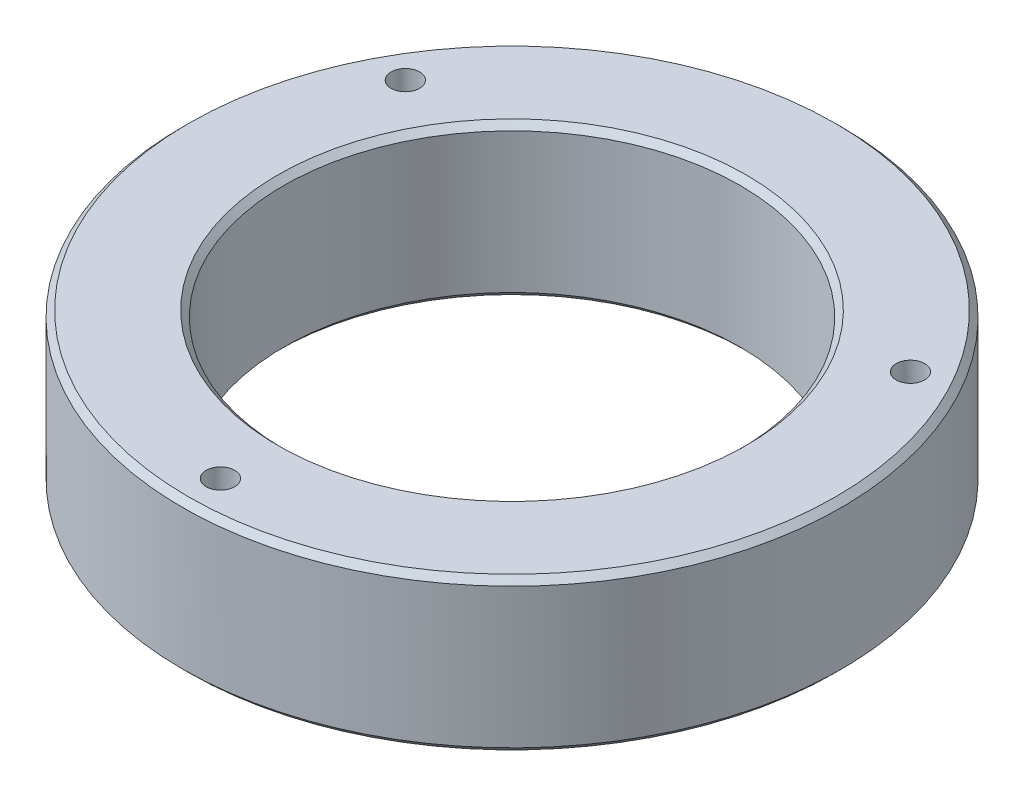
ISO-10303-21;
HEADER;
FILE_DESCRIPTION(('STEP AP214'),'2;1');
FILE_NAME('part.step','',(''),(''),'','','');
FILE_SCHEMA(('AUTOMOTIVE_DESIGN { 1 0 10303 214 1 1 1 1 }'));
ENDSEC;
DATA;
#1=APPLICATION_CONTEXT('core data for automotive mechanical design processes');
#2=APPLICATION_PROTOCOL_DEFINITION('international standard','automotive_design',2000,#1);
#3=PRODUCT_CONTEXT('',#1,'mechanical');
#4=PRODUCT('Part','Part','',(#3));
#5=PRODUCT_RELATED_PRODUCT_CATEGORY('part','',(#4));
#6=PRODUCT_DEFINITION_FORMATION('','',#4);
#7=PRODUCT_DEFINITION_CONTEXT('part definition',#1,'design');
#8=PRODUCT_DEFINITION('design','',#6,#7);
#9=PRODUCT_DEFINITION_SHAPE('','',#8);
#10=(LENGTH_UNIT() NAMED_UNIT(*) SI_UNIT(.MILLI.,.METRE.));
#11=(NAMED_UNIT(*) PLANE_ANGLE_UNIT() SI_UNIT($,.RADIAN.));
#12=(NAMED_UNIT(*) SI_UNIT($,.STERADIAN.) SOLID_ANGLE_UNIT());
#13=UNCERTAINTY_MEASURE_WITH_UNIT(LENGTH_MEASURE(1.E-05),#10,'distance_accuracy_value','');
#14=(GEOMETRIC_REPRESENTATION_CONTEXT(3) GLOBAL_UNCERTAINTY_ASSIGNED_CONTEXT((#13)) GLOBAL_UNIT_ASSIGNED_CONTEXT((#10,
#11,#12)) REPRESENTATION_CONTEXT('',''));
#15=CARTESIAN_POINT('',(0.,0.,0.));
#16=DIRECTION('',(0.,0.,1.));
#17=DIRECTION('',(1.,0.,0.));
#18=AXIS2_PLACEMENT_3D('',#15,#16,#17);
#19=CARTESIAN_POINT('',(-57.15,-19.05,0.));
#20=DIRECTION('',(0.,1.,0.));
#21=DIRECTION('',(0.,0.,1.));
#22=AXIS2_PLACEMENT_3D('',#19,#20,#21);
#23=PLANE('',#22);
#24=CARTESIAN_POINT('',(69.85,-19.05,0.));
#25=DIRECTION('',(0.,-1.,0.));
#26=DIRECTION('',(0.,0.,-1.));
#27=AXIS2_PLACEMENT_3D('',#24,#25,#26);
#28=CIRCLE('',#27,3.96874999999999);
#29=CARTESIAN_POINT('',(69.85,-19.05,-3.96874999999999));
#30=VERTEX_POINT('',#29);
#31=EDGE_CURVE('E75',#30,#30,#28,.T.);
#32=ORIENTED_EDGE('',*,*,#31,.F.);
#33=EDGE_LOOP('',(#32));
#34=FACE_BOUND('',#33,.T.);
#35=CARTESIAN_POINT('',(-69.85,-19.05,0.));
#36=DIRECTION('',(0.,-1.,0.));
#37=DIRECTION('',(0.,0.,-1.));
#38=AXIS2_PLACEMENT_3D('',#35,#36,#37);
#39=CIRCLE('',#38,3.96874999999999);
#40=CARTESIAN_POINT('',(-69.85,-19.05,-3.96874999999999));
#41=VERTEX_POINT('',#40);
#42=EDGE_CURVE('E74',#41,#41,#39,.T.);
#43=ORIENTED_EDGE('',*,*,#42,.F.);
#44=EDGE_LOOP('',(#43));
#45=FACE_BOUND('',#44,.T.);
#46=CARTESIAN_POINT('',(0.,-19.05,73.025));
#47=DIRECTION('',(0.,1.,0.));
#48=DIRECTION('',(0.,0.,1.));
#49=AXIS2_PLACEMENT_3D('',#46,#47,#48);
#50=CIRCLE('',#49,5.5626);
#51=CARTESIAN_POINT('',(0.,-19.05,78.5876));
#52=VERTEX_POINT('',#51);
#53=EDGE_CURVE('E90',#52,#52,#50,.T.);
#54=ORIENTED_EDGE('',*,*,#53,.T.);
#55=EDGE_LOOP('',(#54));
#56=FACE_BOUND('',#55,.T.);
#57=CARTESIAN_POINT('',(63.246,-19.05,-36.5252));
#58=DIRECTION('',(0.,1.,0.));
#59=DIRECTION('',(0.,0.,1.));
#60=AXIS2_PLACEMENT_3D('',#57,#58,#59);
#61=CIRCLE('',#60,5.5626);
#62=CARTESIAN_POINT('',(63.246,-19.05,-30.9626));
#63=VERTEX_POINT('',#62);
#64=EDGE_CURVE('E93',#63,#63,#61,.T.);
#65=ORIENTED_EDGE('',*,*,#64,.T.);
#66=EDGE_LOOP('',(#65));
#67=FACE_BOUND('',#66,.T.);
#68=CARTESIAN_POINT('',(-63.246,-19.05,-36.5252));
#69=DIRECTION('',(0.,1.,0.));
#70=DIRECTION('',(0.,0.,1.));
#71=AXIS2_PLACEMENT_3D('',#68,#69,#70);
#72=CIRCLE('',#71,5.5626);
#73=CARTESIAN_POINT('',(-63.246,-19.05,-30.9626));
#74=VERTEX_POINT('',#73);
#75=EDGE_CURVE('E99',#74,#74,#72,.T.);
#76=ORIENTED_EDGE('',*,*,#75,.T.);
#77=EDGE_LOOP('',(#76));
#78=FACE_BOUND('',#77,.T.);
#79=CARTESIAN_POINT('',(0.,-19.05,0.));
#80=DIRECTION('',(0.,1.,0.));
#81=DIRECTION('',(0.,0.,1.));
#82=AXIS2_PLACEMENT_3D('',#79,#80,#81);
#83=CIRCLE('',#82,58.674);
#84=CARTESIAN_POINT('',(0.,-19.05,-58.674));
#85=VERTEX_POINT('',#84);
#86=EDGE_CURVE('E120',#85,#85,#83,.T.);
#87=ORIENTED_EDGE('',*,*,#86,.T.);
#88=EDGE_LOOP('',(#87));
#89=FACE_BOUND('',#88,.T.);
#90=CARTESIAN_POINT('',(0.,-19.05,0.));
#91=DIRECTION('',(0.,1.,0.));
#92=DIRECTION('',(0.,0.,1.));
#93=AXIS2_PLACEMENT_3D('',#90,#91,#92);
#94=CIRCLE('',#93,81.0006);
#95=CARTESIAN_POINT('',(0.,-19.05,81.0006));
#96=VERTEX_POINT('',#95);
#97=EDGE_CURVE('E117',#96,#96,#94,.F.);
#98=ORIENTED_EDGE('',*,*,#97,.T.);
#99=EDGE_LOOP('',(#98));
#100=FACE_BOUND('',#99,.T.);
#101=ADVANCED_FACE('F47',(#34,#45,#56,#67,#78,#89,#100),#23,.F.);
#102=CARTESIAN_POINT('',(0.,-44.45,0.));
#103=DIRECTION('',(0.,-1.,0.));
#104=DIRECTION('',(0.,0.,-1.));
#105=AXIS2_PLACEMENT_3D('',#102,#103,#104);
#106=CYLINDRICAL_SURFACE('',#105,82.5246);
#107=CARTESIAN_POINT('',(0.,17.526,0.));
#108=DIRECTION('',(0.,-1.,0.));
#109=DIRECTION('',(0.,0.,-1.));
#110=AXIS2_PLACEMENT_3D('',#107,#108,#109);
#111=CIRCLE('',#110,82.5246);
#112=CARTESIAN_POINT('',(0.,17.526,-82.5246));
#113=VERTEX_POINT('',#112);
#114=EDGE_CURVE('E11',#113,#113,#111,.T.);
#115=ORIENTED_EDGE('',*,*,#114,.T.);
#116=EDGE_LOOP('',(#115));
#117=FACE_BOUND('',#116,.T.);
#118=CARTESIAN_POINT('',(0.,-17.526,0.));
#119=DIRECTION('',(0.,1.,0.));
#120=DIRECTION('',(0.,0.,1.));
#121=AXIS2_PLACEMENT_3D('',#118,#119,#120);
#122=CIRCLE('',#121,82.5246);
#123=CARTESIAN_POINT('',(0.,-17.526,82.5246));
#124=VERTEX_POINT('',#123);
#125=EDGE_CURVE('E57',#124,#124,#122,.T.);
#126=ORIENTED_EDGE('',*,*,#125,.T.);
#127=EDGE_LOOP('',(#126));
#128=FACE_BOUND('',#127,.T.);
#129=ADVANCED_FACE('F155',(#117,#128),#106,.T.);
#130=CARTESIAN_POINT('',(-82.5246,19.05,0.));
#131=DIRECTION('',(0.,-1.,0.));
#132=DIRECTION('',(0.,0.,-1.));
#133=AXIS2_PLACEMENT_3D('',#130,#131,#132);
#134=PLANE('',#133);
#135=CARTESIAN_POINT('',(0.,19.05,73.025));
#136=DIRECTION('',(0.,-1.,0.));
#137=DIRECTION('',(0.,0.,-1.));
#138=AXIS2_PLACEMENT_3D('',#135,#136,#137);
#139=CIRCLE('',#138,3.5687);
#140=CARTESIAN_POINT('',(0.,19.05,69.4563));
#141=VERTEX_POINT('',#140);
#142=EDGE_CURVE('E108',#141,#141,#139,.F.);
#143=ORIENTED_EDGE('',*,*,#142,.F.);
#144=EDGE_LOOP('',(#143));
#145=FACE_BOUND('',#144,.T.);
#146=CARTESIAN_POINT('',(63.246,19.05,-36.5252));
#147=DIRECTION('',(0.,-1.,0.));
#148=DIRECTION('',(0.,0.,-1.));
#149=AXIS2_PLACEMENT_3D('',#146,#147,#148);
#150=CIRCLE('',#149,3.5687);
#151=CARTESIAN_POINT('',(63.246,19.05,-40.0939));
#152=VERTEX_POINT('',#151);
#153=EDGE_CURVE('E128',#152,#152,#150,.F.);
#154=ORIENTED_EDGE('',*,*,#153,.F.);
#155=EDGE_LOOP('',(#154));
#156=FACE_BOUND('',#155,.T.);
#157=CARTESIAN_POINT('',(-63.246,19.05,-36.5252));
#158=DIRECTION('',(0.,-1.,0.));
#159=DIRECTION('',(0.,0.,-1.));
#160=AXIS2_PLACEMENT_3D('',#157,#158,#159);
#161=CIRCLE('',#160,3.56869999999999);
#162=CARTESIAN_POINT('',(-63.246,19.05,-40.0939));
#163=VERTEX_POINT('',#162);
#164=EDGE_CURVE('E125',#163,#163,#161,.F.);
#165=ORIENTED_EDGE('',*,*,#164,.F.);
#166=EDGE_LOOP('',(#165));
#167=FACE_BOUND('',#166,.T.);
#168=CARTESIAN_POINT('',(0.,19.05,0.));
#169=DIRECTION('',(0.,-1.,0.));
#170=DIRECTION('',(0.,0.,-1.));
#171=AXIS2_PLACEMENT_3D('',#168,#169,#170);
#172=CIRCLE('',#171,58.674);
#173=CARTESIAN_POINT('',(0.,19.05,-58.674));
#174=VERTEX_POINT('',#173);
#175=EDGE_CURVE('E107',#174,#174,#172,.T.);
#176=ORIENTED_EDGE('',*,*,#175,.T.);
#177=EDGE_LOOP('',(#176));
#178=FACE_BOUND('',#177,.T.);
#179=CARTESIAN_POINT('',(0.,19.05,0.));
#180=DIRECTION('',(0.,-1.,0.));
#181=DIRECTION('',(0.,0.,-1.));
#182=AXIS2_PLACEMENT_3D('',#179,#180,#181);
#183=CIRCLE('',#182,81.0006);
#184=CARTESIAN_POINT('',(0.,19.05,-81.0006));
#185=VERTEX_POINT('',#184);
#186=EDGE_CURVE('E104',#185,#185,#183,.F.);
#187=ORIENTED_EDGE('',*,*,#186,.T.);
#188=EDGE_LOOP('',(#187));
#189=FACE_BOUND('',#188,.T.);
#190=ADVANCED_FACE('F151',(#145,#156,#167,#178,#189),#134,.F.);
#191=CARTESIAN_POINT('',(0.,-44.45,0.));
#192=DIRECTION('',(0.,-1.,0.));
#193=DIRECTION('',(0.,0.,-1.));
#194=AXIS2_PLACEMENT_3D('',#191,#192,#193);
#195=CYLINDRICAL_SURFACE('',#194,57.15);
#196=CARTESIAN_POINT('',(0.,17.526,0.));
#197=DIRECTION('',(0.,-1.,0.));
#198=DIRECTION('',(0.,0.,-1.));
#199=AXIS2_PLACEMENT_3D('',#196,#197,#198);
#200=CIRCLE('',#199,57.15);
#201=CARTESIAN_POINT('',(0.,17.526,-57.15));
#202=VERTEX_POINT('',#201);
#203=EDGE_CURVE('E114',#202,#202,#200,.F.);
#204=CARTESIAN_POINT('',(0.,-17.526,0.));
#205=DIRECTION('',(0.,1.,0.));
#206=DIRECTION('',(0.,0.,1.));
#207=AXIS2_PLACEMENT_3D('',#204,#205,#206);
#208=CIRCLE('',#207,57.15);
#209=CARTESIAN_POINT('',(0.,-17.526,-57.15));
#210=VERTEX_POINT('',#209);
#211=EDGE_CURVE('E111',#210,#210,#208,.F.);
#212=CARTESIAN_POINT('',(0.,17.526,-57.15));
#213=CARTESIAN_POINT('',(0.,17.160875,-57.15));
#214=CARTESIAN_POINT('',(0.,16.79575,-57.15));
#215=CARTESIAN_POINT('',(0.,16.0655,-57.15));
#216=CARTESIAN_POINT('',(0.,15.700375,-57.15));
#217=CARTESIAN_POINT('',(0.,14.970125,-57.15));
#218=CARTESIAN_POINT('',(0.,14.605,-57.15));
#219=CARTESIAN_POINT('',(0.,13.87475,-57.15));
#220=CARTESIAN_POINT('',(0.,13.509625,-57.15));
#221=CARTESIAN_POINT('',(0.,12.779375,-57.15));
#222=CARTESIAN_POINT('',(0.,12.41425,-57.15));
#223=CARTESIAN_POINT('',(0.,11.684,-57.15));
#224=CARTESIAN_POINT('',(0.,11.318875,-57.15));
#225=CARTESIAN_POINT('',(0.,10.588625,-57.15));
#226=CARTESIAN_POINT('',(0.,10.2235,-57.15));
#227=CARTESIAN_POINT('',(0.,9.49324999999998,-57.15));
#228=CARTESIAN_POINT('',(0.,9.12812499999998,-57.15));
#229=CARTESIAN_POINT('',(0.,8.39787499999998,-57.15));
#230=CARTESIAN_POINT('',(0.,8.03274999999998,-57.15));
#231=CARTESIAN_POINT('',(0.,7.30249999999998,-57.15));
#232=CARTESIAN_POINT('',(0.,6.93737499999998,-57.15));
#233=CARTESIAN_POINT('',(0.,6.20712499999998,-57.15));
#234=CARTESIAN_POINT('',(0.,5.84199999999998,-57.15));
#235=CARTESIAN_POINT('',(0.,5.11174999999998,-57.15));
#236=CARTESIAN_POINT('',(0.,4.74662499999998,-57.15));
#237=CARTESIAN_POINT('',(0.,4.01637499999998,-57.15));
#238=CARTESIAN_POINT('',(0.,3.65124999999998,-57.15));
#239=CARTESIAN_POINT('',(0.,2.92099999999998,-57.15));
#240=CARTESIAN_POINT('',(0.,2.55587499999998,-57.15));
#241=CARTESIAN_POINT('',(0.,1.82562499999998,-57.15));
#242=CARTESIAN_POINT('',(0.,1.46049999999998,-57.15));
#243=CARTESIAN_POINT('',(0.,0.730249999999976,-57.15));
#244=CARTESIAN_POINT('',(0.,0.365124999999978,-57.15));
#245=CARTESIAN_POINT('',(0.,-0.365125000000019,-57.15));
#246=CARTESIAN_POINT('',(0.,-0.730250000000018,-57.15));
#247=CARTESIAN_POINT('',(0.,-1.46050000000002,-57.15));
#248=CARTESIAN_POINT('',(0.,-1.82562500000002,-57.15));
#249=CARTESIAN_POINT('',(0.,-2.55587500000002,-57.15));
#250=CARTESIAN_POINT('',(0.,-2.92100000000002,-57.15));
#251=CARTESIAN_POINT('',(0.,-3.65125000000002,-57.15));
#252=CARTESIAN_POINT('',(0.,-4.01637500000002,-57.15));
#253=CARTESIAN_POINT('',(0.,-4.74662500000002,-57.15));
#254=CARTESIAN_POINT('',(0.,-5.11175000000002,-57.15));
#255=CARTESIAN_POINT('',(0.,-5.84200000000002,-57.15));
#256=CARTESIAN_POINT('',(0.,-6.20712500000002,-57.15));
#257=CARTESIAN_POINT('',(0.,-6.93737500000002,-57.15));
#258=CARTESIAN_POINT('',(0.,-7.30250000000002,-57.15));
#259=CARTESIAN_POINT('',(0.,-8.03275000000002,-57.15));
#260=CARTESIAN_POINT('',(0.,-8.39787500000002,-57.15));
#261=CARTESIAN_POINT('',(0.,-9.12812500000002,-57.15));
#262=CARTESIAN_POINT('',(0.,-9.49325000000002,-57.15));
#263=CARTESIAN_POINT('',(0.,-10.2235,-57.15));
#264=CARTESIAN_POINT('',(0.,-10.588625,-57.15));
#265=CARTESIAN_POINT('',(0.,-11.318875,-57.15));
#266=CARTESIAN_POINT('',(0.,-11.684,-57.15));
#267=CARTESIAN_POINT('',(0.,-12.41425,-57.15));
#268=CARTESIAN_POINT('',(0.,-12.779375,-57.15));
#269=CARTESIAN_POINT('',(0.,-13.509625,-57.15));
#270=CARTESIAN_POINT('',(0.,-13.87475,-57.15));
#271=CARTESIAN_POINT('',(0.,-14.605,-57.15));
#272=CARTESIAN_POINT('',(0.,-14.970125,-57.15));
#273=CARTESIAN_POINT('',(0.,-15.700375,-57.15));
#274=CARTESIAN_POINT('',(0.,-16.0655,-57.15));
#275=CARTESIAN_POINT('',(0.,-16.79575,-57.15));
#276=CARTESIAN_POINT('',(0.,-17.160875,-57.15));
#277=CARTESIAN_POINT('',(0.,-17.526,-57.15));
#278=B_SPLINE_CURVE_WITH_KNOTS('',3,(#212,#213,#214,#215,#216,#217,#218,#219,#220,#221,#222,
#223,#224,#225,#226,#227,#228,#229,#230,#231,#232,#233,#234,#235,#236,#237,#238,#239,#240,#241,
#242,#243,#244,#245,#246,#247,#248,#249,#250,#251,#252,#253,#254,#255,#256,#257,#258,#259,#260,
#261,#262,#263,#264,#265,#266,#267,#268,#269,#270,#271,#272,#273,#274,#275,#276,#277),
.UNSPECIFIED.,.F.,.F.,(4,2,2,2,2,2,2,2,2,2,2,2,2,2,2,2,2,2,2,2,2,2,2,2,2,2,2,2,2,2,2,2,4),(0.,
1.095375,2.19075,3.286125,4.3815,5.476875,6.57225,7.667625,8.763,9.858375,10.95375,12.049125,
13.1445,14.239875,15.33525,16.430625,17.526,18.621375,19.71675,20.812125,21.9075,23.002875,
24.09825,25.193625,26.289,27.384375,28.47975,29.575125,30.6705,31.765875,32.86125,33.956625,
35.052),.UNSPECIFIED.);
#279=EDGE_CURVE('BSEAM154',#202,#210,#278,.T.);
#280=ORIENTED_EDGE('',*,*,#203,.T.);
#281=ORIENTED_EDGE('',*,*,#211,.T.);
#282=ORIENTED_EDGE('',*,*,#279,.T.);
#283=ORIENTED_EDGE('',*,*,#279,.F.);
#284=EDGE_LOOP('',(#280,#282,#281,#283));
#285=FACE_BOUND('',#284,.T.);
#286=ADVANCED_FACE('F154',(#285),#195,.F.);
#287=CARTESIAN_POINT('',(0.,19.05,0.));
#288=DIRECTION('',(0.,1.,0.));
#289=DIRECTION('',(0.,0.,1.));
#290=AXIS2_PLACEMENT_3D('',#287,#288,#289);
#291=CONICAL_SURFACE('',#290,58.674,0.785398163397435);
#292=ORIENTED_EDGE('',*,*,#203,.F.);
#293=EDGE_LOOP('',(#292));
#294=FACE_BOUND('',#293,.T.);
#295=ORIENTED_EDGE('',*,*,#175,.F.);
#296=EDGE_LOOP('',(#295));
#297=FACE_BOUND('',#296,.T.);
#298=ADVANCED_FACE('F186',(#294,#297),#291,.F.);
#299=CARTESIAN_POINT('',(0.,-17.526,0.));
#300=DIRECTION('',(0.,-1.,0.));
#301=DIRECTION('',(0.,0.,-1.));
#302=AXIS2_PLACEMENT_3D('',#299,#300,#301);
#303=CONICAL_SURFACE('',#302,57.15,0.785398163397451);
#304=CARTESIAN_POINT('',(0.,-19.05,-58.674));
#305=CARTESIAN_POINT('',(0.,-19.034125,-58.658125));
#306=CARTESIAN_POINT('',(0.,-19.01825,-58.64225));
#307=CARTESIAN_POINT('',(0.,-18.9865,-58.6105));
#308=CARTESIAN_POINT('',(0.,-18.970625,-58.594625));
#309=CARTESIAN_POINT('',(0.,-18.938875,-58.562875));
#310=CARTESIAN_POINT('',(0.,-18.923,-58.547));
#311=CARTESIAN_POINT('',(0.,-18.89125,-58.51525));
#312=CARTESIAN_POINT('',(0.,-18.875375,-58.499375));
#313=CARTESIAN_POINT('',(0.,-18.843625,-58.467625));
#314=CARTESIAN_POINT('',(0.,-18.82775,-58.45175));
#315=CARTESIAN_POINT('',(0.,-18.796,-58.42));
#316=CARTESIAN_POINT('',(0.,-18.780125,-58.404125));
#317=CARTESIAN_POINT('',(0.,-18.748375,-58.372375));
#318=CARTESIAN_POINT('',(0.,-18.7325,-58.3565));
#319=CARTESIAN_POINT('',(0.,-18.70075,-58.32475));
#320=CARTESIAN_POINT('',(0.,-18.684875,-58.308875));
#321=CARTESIAN_POINT('',(0.,-18.653125,-58.277125));
#322=CARTESIAN_POINT('',(0.,-18.63725,-58.26125));
#323=CARTESIAN_POINT('',(0.,-18.6055,-58.2295));
#324=CARTESIAN_POINT('',(0.,-18.589625,-58.213625));
#325=CARTESIAN_POINT('',(0.,-18.557875,-58.181875));
#326=CARTESIAN_POINT('',(0.,-18.542,-58.166));
#327=CARTESIAN_POINT('',(0.,-18.51025,-58.13425));
#328=CARTESIAN_POINT('',(0.,-18.494375,-58.118375));
#329=CARTESIAN_POINT('',(0.,-18.462625,-58.086625));
#330=CARTESIAN_POINT('',(0.,-18.44675,-58.07075));
#331=CARTESIAN_POINT('',(0.,-18.415,-58.039));
#332=CARTESIAN_POINT('',(0.,-18.399125,-58.023125));
#333=CARTESIAN_POINT('',(0.,-18.367375,-57.991375));
#334=CARTESIAN_POINT('',(0.,-18.3515,-57.9755));
#335=CARTESIAN_POINT('',(0.,-18.31975,-57.94375));
#336=CARTESIAN_POINT('',(0.,-18.303875,-57.927875));
#337=CARTESIAN_POINT('',(0.,-18.272125,-57.896125));
#338=CARTESIAN_POINT('',(0.,-18.25625,-57.88025));
#339=CARTESIAN_POINT('',(0.,-18.2245,-57.8485));
#340=CARTESIAN_POINT('',(0.,-18.208625,-57.832625));
#341=CARTESIAN_POINT('',(0.,-18.176875,-57.800875));
#342=CARTESIAN_POINT('',(0.,-18.161,-57.785));
#343=CARTESIAN_POINT('',(0.,-18.12925,-57.75325));
#344=CARTESIAN_POINT('',(0.,-18.113375,-57.737375));
#345=CARTESIAN_POINT('',(0.,-18.081625,-57.705625));
#346=CARTESIAN_POINT('',(0.,-18.06575,-57.68975));
#347=CARTESIAN_POINT('',(0.,-18.034,-57.658));
#348=CARTESIAN_POINT('',(0.,-18.018125,-57.642125));
#349=CARTESIAN_POINT('',(0.,-17.986375,-57.610375));
#350=CARTESIAN_POINT('',(0.,-17.9705,-57.5945));
#351=CARTESIAN_POINT('',(0.,-17.93875,-57.56275));
#352=CARTESIAN_POINT('',(0.,-17.922875,-57.546875));
#353=CARTESIAN_POINT('',(0.,-17.891125,-57.515125));
#354=CARTESIAN_POINT('',(0.,-17.87525,-57.49925));
#355=CARTESIAN_POINT('',(0.,-17.8435,-57.4675));
#356=CARTESIAN_POINT('',(0.,-17.827625,-57.451625));
#357=CARTESIAN_POINT('',(0.,-17.795875,-57.419875));
#358=CARTESIAN_POINT('',(0.,-17.78,-57.404));
#359=CARTESIAN_POINT('',(0.,-17.74825,-57.37225));
#360=CARTESIAN_POINT('',(0.,-17.732375,-57.356375));
#361=CARTESIAN_POINT('',(0.,-17.700625,-57.324625));
#362=CARTESIAN_POINT('',(0.,-17.68475,-57.30875));
#363=CARTESIAN_POINT('',(0.,-17.653,-57.277));
#364=CARTESIAN_POINT('',(0.,-17.637125,-57.261125));
#365=CARTESIAN_POINT('',(0.,-17.605375,-57.229375));
#366=CARTESIAN_POINT('',(0.,-17.5895,-57.2135));
#367=CARTESIAN_POINT('',(0.,-17.55775,-57.18175));
#368=CARTESIAN_POINT('',(0.,-17.541875,-57.165875));
#369=CARTESIAN_POINT('',(0.,-17.526,-57.15));
#370=B_SPLINE_CURVE_WITH_KNOTS('',3,(#304,#305,#306,#307,#308,#309,#310,#311,#312,#313,#314,
#315,#316,#317,#318,#319,#320,#321,#322,#323,#324,#325,#326,#327,#328,#329,#330,#331,#332,#333,
#334,#335,#336,#337,#338,#339,#340,#341,#342,#343,#344,#345,#346,#347,#348,#349,#350,#351,#352,
#353,#354,#355,#356,#357,#358,#359,#360,#361,#362,#363,#364,#365,#366,#367,#368,#369),
.UNSPECIFIED.,.F.,.F.,(4,2,2,2,2,2,2,2,2,2,2,2,2,2,2,2,2,2,2,2,2,2,2,2,2,2,2,2,2,2,2,2,4),(0.,
0.0673519209080149,0.134703841816037,0.202055762724052,0.269407683632072,0.336759604540087,
0.404111525448106,0.471463446356126,0.538815367264141,0.606167288172161,0.673519209080176,
0.740871129988195,0.80822305089621,0.87557497180423,0.94292689271225,1.01027881362026,
1.07763073452828,1.1449826554363,1.21233457634432,1.27968649725234,1.34703841816036,
1.41439033906838,1.48174225997639,1.54909418088441,1.61644610179242,1.68379802270044,
1.75114994360846,1.81850186451648,1.88585378542449,1.95320570633251,2.02055762724053,
2.08790954814855,2.15526146905657),.UNSPECIFIED.);
#371=EDGE_CURVE('BSEAM165',#85,#210,#370,.T.);
#372=ORIENTED_EDGE('',*,*,#86,.F.);
#373=ORIENTED_EDGE('',*,*,#211,.F.);
#374=ORIENTED_EDGE('',*,*,#371,.T.);
#375=ORIENTED_EDGE('',*,*,#371,.F.);
#376=EDGE_LOOP('',(#372,#374,#373,#375));
#377=FACE_BOUND('',#376,.T.);
#378=ADVANCED_FACE('F165',(#377),#303,.F.);
#379=CARTESIAN_POINT('',(0.,17.526,0.));
#380=DIRECTION('',(0.,-1.,0.));
#381=DIRECTION('',(0.,0.,-1.));
#382=AXIS2_PLACEMENT_3D('',#379,#380,#381);
#383=CONICAL_SURFACE('',#382,82.5246,0.785398163397451);
#384=ORIENTED_EDGE('',*,*,#186,.F.);
#385=EDGE_LOOP('',(#384));
#386=FACE_BOUND('',#385,.T.);
#387=ORIENTED_EDGE('',*,*,#114,.F.);
#388=EDGE_LOOP('',(#387));
#389=FACE_BOUND('',#388,.T.);
#390=ADVANCED_FACE('F162',(#386,#389),#383,.T.);
#391=CARTESIAN_POINT('',(0.,-19.05,0.));
#392=DIRECTION('',(0.,1.,0.));
#393=DIRECTION('',(0.,0.,1.));
#394=AXIS2_PLACEMENT_3D('',#391,#392,#393);
#395=CONICAL_SURFACE('',#394,81.0006,0.785398163397448);
#396=ORIENTED_EDGE('',*,*,#125,.F.);
#397=EDGE_LOOP('',(#396));
#398=FACE_BOUND('',#397,.T.);
#399=ORIENTED_EDGE('',*,*,#97,.F.);
#400=EDGE_LOOP('',(#399));
#401=FACE_BOUND('',#400,.T.);
#402=ADVANCED_FACE('F50',(#398,#401),#395,.T.);
#403=CARTESIAN_POINT('',(-63.246,57.15,-36.5252));
#404=DIRECTION('',(0.,-1.,0.));
#405=DIRECTION('',(0.,0.,-1.));
#406=AXIS2_PLACEMENT_3D('',#403,#404,#405);
#407=CYLINDRICAL_SURFACE('',#406,3.56869999999999);
#408=CARTESIAN_POINT('',(-63.246,-9.398,-36.5252));
#409=DIRECTION('',(0.,1.,0.));
#410=DIRECTION('',(0.,0.,1.));
#411=AXIS2_PLACEMENT_3D('',#408,#409,#410);
#412=CIRCLE('',#411,3.56869999999999);
#413=CARTESIAN_POINT('',(-63.246,-9.398,-32.9565));
#414=VERTEX_POINT('',#413);
#415=EDGE_CURVE('E52',#414,#414,#412,.T.);
#416=ORIENTED_EDGE('',*,*,#415,.F.);
#417=EDGE_LOOP('',(#416));
#418=FACE_BOUND('',#417,.T.);
#419=ORIENTED_EDGE('',*,*,#164,.T.);
#420=EDGE_LOOP('',(#419));
#421=FACE_BOUND('',#420,.T.);
#422=ADVANCED_FACE('F144',(#418,#421),#407,.F.);
#423=CARTESIAN_POINT('',(63.246,57.15,-36.5252));
#424=DIRECTION('',(0.,-1.,0.));
#425=DIRECTION('',(0.,0.,-1.));
#426=AXIS2_PLACEMENT_3D('',#423,#424,#425);
#427=CYLINDRICAL_SURFACE('',#426,3.5687);
#428=CARTESIAN_POINT('',(63.246,-9.398,-36.5252));
#429=DIRECTION('',(0.,1.,0.));
#430=DIRECTION('',(0.,0.,1.));
#431=AXIS2_PLACEMENT_3D('',#428,#429,#430);
#432=CIRCLE('',#431,3.5687);
#433=CARTESIAN_POINT('',(63.246,-9.398,-32.9565));
#434=VERTEX_POINT('',#433);
#435=EDGE_CURVE('E134',#434,#434,#432,.T.);
#436=ORIENTED_EDGE('',*,*,#435,.F.);
#437=EDGE_LOOP('',(#436));
#438=FACE_BOUND('',#437,.T.);
#439=ORIENTED_EDGE('',*,*,#153,.T.);
#440=EDGE_LOOP('',(#439));
#441=FACE_BOUND('',#440,.T.);
#442=ADVANCED_FACE('F147',(#438,#441),#427,.F.);
#443=CARTESIAN_POINT('',(0.,57.15,73.025));
#444=DIRECTION('',(0.,-1.,0.));
#445=DIRECTION('',(0.,0.,-1.));
#446=AXIS2_PLACEMENT_3D('',#443,#444,#445);
#447=CYLINDRICAL_SURFACE('',#446,3.5687);
#448=CARTESIAN_POINT('',(0.,-9.398,73.025));
#449=DIRECTION('',(0.,1.,0.));
#450=DIRECTION('',(0.,0.,1.));
#451=AXIS2_PLACEMENT_3D('',#448,#449,#450);
#452=CIRCLE('',#451,3.5687);
#453=CARTESIAN_POINT('',(0.,-9.398,76.5937));
#454=VERTEX_POINT('',#453);
#455=EDGE_CURVE('E89',#454,#454,#452,.T.);
#456=ORIENTED_EDGE('',*,*,#455,.F.);
#457=EDGE_LOOP('',(#456));
#458=FACE_BOUND('',#457,.T.);
#459=ORIENTED_EDGE('',*,*,#142,.T.);
#460=EDGE_LOOP('',(#459));
#461=FACE_BOUND('',#460,.T.);
#462=ADVANCED_FACE('F216',(#458,#461),#447,.F.);
#463=CARTESIAN_POINT('',(0.,-9.398,73.025));
#464=DIRECTION('',(0.,-1.,0.));
#465=DIRECTION('',(0.,0.,-1.));
#466=AXIS2_PLACEMENT_3D('',#463,#464,#465);
#467=CYLINDRICAL_SURFACE('',#466,5.5626);
#468=CARTESIAN_POINT('',(0.,-9.398,73.025));
#469=DIRECTION('',(0.,1.,0.));
#470=DIRECTION('',(0.,0.,1.));
#471=AXIS2_PLACEMENT_3D('',#468,#469,#470);
#472=CIRCLE('',#471,5.5626);
#473=CARTESIAN_POINT('',(0.,-9.398,78.5876));
#474=VERTEX_POINT('',#473);
#475=EDGE_CURVE('E86',#474,#474,#472,.T.);
#476=ORIENTED_EDGE('',*,*,#475,.T.);
#477=EDGE_LOOP('',(#476));
#478=FACE_BOUND('',#477,.T.);
#479=ORIENTED_EDGE('',*,*,#53,.F.);
#480=EDGE_LOOP('',(#479));
#481=FACE_BOUND('',#480,.T.);
#482=ADVANCED_FACE('F220',(#478,#481),#467,.F.);
#483=CARTESIAN_POINT('',(0.,-9.398,73.025));
#484=DIRECTION('',(0.,1.,0.));
#485=DIRECTION('',(0.,0.,1.));
#486=AXIS2_PLACEMENT_3D('',#483,#484,#485);
#487=PLANE('',#486);
#488=ORIENTED_EDGE('',*,*,#455,.T.);
#489=EDGE_LOOP('',(#488));
#490=FACE_BOUND('',#489,.T.);
#491=ORIENTED_EDGE('',*,*,#475,.F.);
#492=EDGE_LOOP('',(#491));
#493=FACE_BOUND('',#492,.T.);
#494=ADVANCED_FACE('F235',(#490,#493),#487,.F.);
#495=CARTESIAN_POINT('',(63.246,-9.398,-36.5252));
#496=DIRECTION('',(0.,-1.,0.));
#497=DIRECTION('',(0.,0.,-1.));
#498=AXIS2_PLACEMENT_3D('',#495,#496,#497);
#499=CYLINDRICAL_SURFACE('',#498,5.5626);
#500=CARTESIAN_POINT('',(63.246,-9.398,-36.5252));
#501=DIRECTION('',(0.,1.,0.));
#502=DIRECTION('',(0.,0.,1.));
#503=AXIS2_PLACEMENT_3D('',#500,#501,#502);
#504=CIRCLE('',#503,5.5626);
#505=CARTESIAN_POINT('',(63.246,-9.398,-30.9626));
#506=VERTEX_POINT('',#505);
#507=EDGE_CURVE('E96',#506,#506,#504,.T.);
#508=ORIENTED_EDGE('',*,*,#507,.T.);
#509=EDGE_LOOP('',(#508));
#510=FACE_BOUND('',#509,.T.);
#511=ORIENTED_EDGE('',*,*,#64,.F.);
#512=EDGE_LOOP('',(#511));
#513=FACE_BOUND('',#512,.T.);
#514=ADVANCED_FACE('F232',(#510,#513),#499,.F.);
#515=CARTESIAN_POINT('',(63.246,-9.398,-36.5252));
#516=DIRECTION('',(0.,1.,0.));
#517=DIRECTION('',(0.,0.,1.));
#518=AXIS2_PLACEMENT_3D('',#515,#516,#517);
#519=PLANE('',#518);
#520=ORIENTED_EDGE('',*,*,#435,.T.);
#521=EDGE_LOOP('',(#520));
#522=FACE_BOUND('',#521,.T.);
#523=ORIENTED_EDGE('',*,*,#507,.F.);
#524=EDGE_LOOP('',(#523));
#525=FACE_BOUND('',#524,.T.);
#526=ADVANCED_FACE('F228',(#522,#525),#519,.F.);
#527=CARTESIAN_POINT('',(-63.246,-9.398,-36.5252));
#528=DIRECTION('',(0.,-1.,0.));
#529=DIRECTION('',(0.,0.,-1.));
#530=AXIS2_PLACEMENT_3D('',#527,#528,#529);
#531=CYLINDRICAL_SURFACE('',#530,5.5626);
#532=CARTESIAN_POINT('',(-63.246,-9.398,-36.5252));
#533=DIRECTION('',(0.,1.,0.));
#534=DIRECTION('',(0.,0.,1.));
#535=AXIS2_PLACEMENT_3D('',#532,#533,#534);
#536=CIRCLE('',#535,5.5626);
#537=CARTESIAN_POINT('',(-63.246,-9.398,-30.9626));
#538=VERTEX_POINT('',#537);
#539=EDGE_CURVE('E85',#538,#538,#536,.T.);
#540=ORIENTED_EDGE('',*,*,#539,.T.);
#541=EDGE_LOOP('',(#540));
#542=FACE_BOUND('',#541,.T.);
#543=ORIENTED_EDGE('',*,*,#75,.F.);
#544=EDGE_LOOP('',(#543));
#545=FACE_BOUND('',#544,.T.);
#546=ADVANCED_FACE('F225',(#542,#545),#531,.F.);
#547=CARTESIAN_POINT('',(-63.246,-9.398,-36.5252));
#548=DIRECTION('',(0.,1.,0.));
#549=DIRECTION('',(0.,0.,1.));
#550=AXIS2_PLACEMENT_3D('',#547,#548,#549);
#551=PLANE('',#550);
#552=ORIENTED_EDGE('',*,*,#415,.T.);
#553=EDGE_LOOP('',(#552));
#554=FACE_BOUND('',#553,.T.);
#555=ORIENTED_EDGE('',*,*,#539,.F.);
#556=EDGE_LOOP('',(#555));
#557=FACE_BOUND('',#556,.T.);
#558=ADVANCED_FACE('F141',(#554,#557),#551,.F.);
#559=CARTESIAN_POINT('',(-69.85,6.35000000000001,0.));
#560=DIRECTION('',(0.,-1.,0.));
#561=DIRECTION('',(0.,0.,-1.));
#562=AXIS2_PLACEMENT_3D('',#559,#560,#561);
#563=CONICAL_SURFACE('',#562,3.96874999999999,1.02974425867665);
#564=CARTESIAN_POINT('',(-69.85,8.73466558176564,0.));
#565=VERTEX_POINT('',#564);
#566=VERTEX_LOOP('',#565);
#567=FACE_BOUND('',#566,.T.);
#568=CARTESIAN_POINT('',(-69.85,6.35000000000001,0.));
#569=DIRECTION('',(0.,-1.,0.));
#570=DIRECTION('',(0.,0.,-1.));
#571=AXIS2_PLACEMENT_3D('',#568,#569,#570);
#572=CIRCLE('',#571,3.96874999999999);
#573=CARTESIAN_POINT('',(-69.85,6.35000000000001,-3.96874999999999));
#574=VERTEX_POINT('',#573);
#575=EDGE_CURVE('E78',#574,#574,#572,.T.);
#576=ORIENTED_EDGE('',*,*,#575,.T.);
#577=EDGE_LOOP('',(#576));
#578=FACE_BOUND('',#577,.T.);
#579=ADVANCED_FACE('F224',(#567,#578),#563,.F.);
#580=CARTESIAN_POINT('',(-69.85,-19.05,0.));
#581=DIRECTION('',(0.,-1.,0.));
#582=DIRECTION('',(0.,0.,-1.));
#583=AXIS2_PLACEMENT_3D('',#580,#581,#582);
#584=CYLINDRICAL_SURFACE('',#583,3.96874999999999);
#585=ORIENTED_EDGE('',*,*,#575,.F.);
#586=EDGE_LOOP('',(#585));
#587=FACE_BOUND('',#586,.T.);
#588=ORIENTED_EDGE('',*,*,#42,.T.);
#589=EDGE_LOOP('',(#588));
#590=FACE_BOUND('',#589,.T.);
#591=ADVANCED_FACE('F68',(#587,#590),#584,.F.);
#592=CARTESIAN_POINT('',(69.85,6.35000000000001,0.));
#593=DIRECTION('',(0.,-1.,0.));
#594=DIRECTION('',(0.,0.,-1.));
#595=AXIS2_PLACEMENT_3D('',#592,#593,#594);
#596=CONICAL_SURFACE('',#595,3.96874999999999,1.02974425867665);
#597=CARTESIAN_POINT('',(69.85,8.73466558176564,0.));
#598=VERTEX_POINT('',#597);
#599=VERTEX_LOOP('',#598);
#600=FACE_BOUND('',#599,.T.);
#601=CARTESIAN_POINT('',(69.85,6.35000000000001,0.));
#602=DIRECTION('',(0.,-1.,0.));
#603=DIRECTION('',(0.,0.,-1.));
#604=AXIS2_PLACEMENT_3D('',#601,#602,#603);
#605=CIRCLE('',#604,3.96874999999999);
#606=CARTESIAN_POINT('',(69.85,6.35000000000001,-3.96874999999999));
#607=VERTEX_POINT('',#606);
#608=EDGE_CURVE('E72',#607,#607,#605,.T.);
#609=ORIENTED_EDGE('',*,*,#608,.T.);
#610=EDGE_LOOP('',(#609));
#611=FACE_BOUND('',#610,.T.);
#612=ADVANCED_FACE('F64',(#600,#611),#596,.F.);
#613=CARTESIAN_POINT('',(69.85,-19.05,0.));
#614=DIRECTION('',(0.,-1.,0.));
#615=DIRECTION('',(0.,0.,-1.));
#616=AXIS2_PLACEMENT_3D('',#613,#614,#615);
#617=CYLINDRICAL_SURFACE('',#616,3.96874999999999);
#618=ORIENTED_EDGE('',*,*,#608,.F.);
#619=EDGE_LOOP('',(#618));
#620=FACE_BOUND('',#619,.T.);
#621=ORIENTED_EDGE('',*,*,#31,.T.);
#622=EDGE_LOOP('',(#621));
#623=FACE_BOUND('',#622,.T.);
#624=ADVANCED_FACE('F67',(#620,#623),#617,.F.);
#625=CLOSED_SHELL('',(#101,#129,#190,#286,#298,#378,#390,#402,#422,#442,#462,#482,#494,#514,
#526,#546,#558,#579,#591,#612,#624));
#626=MANIFOLD_SOLID_BREP('B2',#625);
#627=ADVANCED_BREP_SHAPE_REPRESENTATION('',(#18,#626),#14);
#628=SHAPE_DEFINITION_REPRESENTATION(#9,#627);
ENDSEC;
END-ISO-10303-21;
